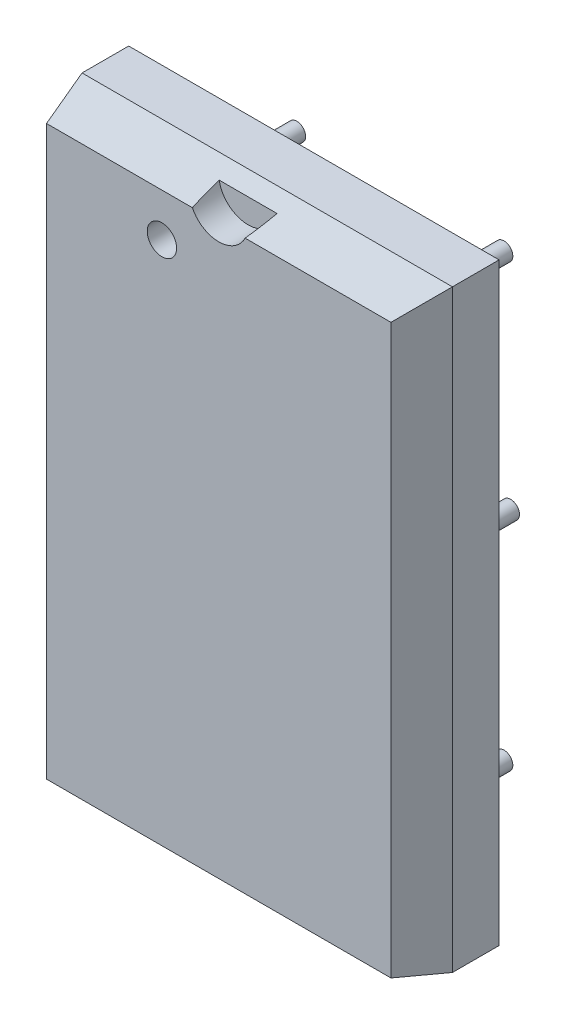
ISO-10303-21;
HEADER;
FILE_DESCRIPTION(('STEP AP214'),'2;1');
FILE_NAME('part.step','',(''),(''),'','','');
FILE_SCHEMA(('AUTOMOTIVE_DESIGN { 1 0 10303 214 1 1 1 1 }'));
ENDSEC;
DATA;
#1=APPLICATION_CONTEXT('core data for automotive mechanical design processes');
#2=APPLICATION_PROTOCOL_DEFINITION('international standard','automotive_design',2000,#1);
#3=PRODUCT_CONTEXT('',#1,'mechanical');
#4=PRODUCT('Part','Part','',(#3));
#5=PRODUCT_RELATED_PRODUCT_CATEGORY('part','',(#4));
#6=PRODUCT_DEFINITION_FORMATION('','',#4);
#7=PRODUCT_DEFINITION_CONTEXT('part definition',#1,'design');
#8=PRODUCT_DEFINITION('design','',#6,#7);
#9=PRODUCT_DEFINITION_SHAPE('','',#8);
#10=(LENGTH_UNIT() NAMED_UNIT(*) SI_UNIT(.MILLI.,.METRE.));
#11=(NAMED_UNIT(*) PLANE_ANGLE_UNIT() SI_UNIT($,.RADIAN.));
#12=(NAMED_UNIT(*) SI_UNIT($,.STERADIAN.) SOLID_ANGLE_UNIT());
#13=UNCERTAINTY_MEASURE_WITH_UNIT(LENGTH_MEASURE(1.E-05),#10,'distance_accuracy_value','');
#14=(GEOMETRIC_REPRESENTATION_CONTEXT(3) GLOBAL_UNCERTAINTY_ASSIGNED_CONTEXT((#13)) GLOBAL_UNIT_ASSIGNED_CONTEXT((#10,
#11,#12)) REPRESENTATION_CONTEXT('',''));
#15=CARTESIAN_POINT('',(0.,0.,0.));
#16=DIRECTION('',(0.,0.,1.));
#17=DIRECTION('',(1.,0.,0.));
#18=AXIS2_PLACEMENT_3D('',#15,#16,#17);
#19=CARTESIAN_POINT('',(-2.16999999999997,-17.72,0.64));
#20=DIRECTION('',(0.,0.,1.));
#21=DIRECTION('',(1.,0.,0.));
#22=AXIS2_PLACEMENT_3D('',#19,#20,#21);
#23=PLANE('',#22);
#24=CARTESIAN_POINT('',(0.606517470560689,-0.120000000000002,0.64));
#25=DIRECTION('',(0.,0.,1.));
#26=DIRECTION('',(1.,0.,0.));
#27=AXIS2_PLACEMENT_3D('',#24,#25,#26);
#28=CIRCLE('',#27,0.3);
#29=CARTESIAN_POINT('',(0.90651747056069,-0.120000000000002,0.64));
#30=VERTEX_POINT('',#29);
#31=EDGE_CURVE('E39',#30,#30,#28,.F.);
#32=ORIENTED_EDGE('',*,*,#31,.F.);
#33=EDGE_LOOP('',(#32));
#34=FACE_BOUND('',#33,.T.);
#35=CARTESIAN_POINT('',(7.65348252943937,-15.12,0.64));
#36=DIRECTION('',(0.,0.,1.));
#37=DIRECTION('',(1.,0.,0.));
#38=AXIS2_PLACEMENT_3D('',#35,#36,#37);
#39=CIRCLE('',#38,0.3);
#40=CARTESIAN_POINT('',(7.95348252943937,-15.12,0.64));
#41=VERTEX_POINT('',#40);
#42=EDGE_CURVE('E199',#41,#41,#39,.F.);
#43=ORIENTED_EDGE('',*,*,#42,.F.);
#44=EDGE_LOOP('',(#43));
#45=FACE_BOUND('',#44,.T.);
#46=CARTESIAN_POINT('',(7.88000000000003,-7.62,0.64));
#47=DIRECTION('',(0.,0.,1.));
#48=DIRECTION('',(1.,0.,0.));
#49=AXIS2_PLACEMENT_3D('',#46,#47,#48);
#50=CIRCLE('',#49,0.3);
#51=CARTESIAN_POINT('',(8.18000000000003,-7.62,0.64));
#52=VERTEX_POINT('',#51);
#53=EDGE_CURVE('E193',#52,#52,#50,.F.);
#54=ORIENTED_EDGE('',*,*,#53,.F.);
#55=EDGE_LOOP('',(#54));
#56=FACE_BOUND('',#55,.T.);
#57=DIRECTION('',(0.,1.,0.));
#58=VECTOR('',#57,1.);
#59=CARTESIAN_POINT('',(-0.519999999999953,2.48,0.64));
#60=LINE('',#59,#58);
#61=CARTESIAN_POINT('',(-0.519999999999953,-16.07,0.64));
#62=VERTEX_POINT('',#61);
#63=CARTESIAN_POINT('',(-0.519999999999953,0.829999999999977,0.64));
#64=VERTEX_POINT('',#63);
#65=EDGE_CURVE('E53',#62,#64,#60,.T.);
#66=ORIENTED_EDGE('',*,*,#65,.T.);
#67=DIRECTION('',(1.,0.,0.));
#68=VECTOR('',#67,1.);
#69=CARTESIAN_POINT('',(10.43,0.829999999999977,0.64));
#70=LINE('',#69,#68);
#71=CARTESIAN_POINT('',(8.78000000000001,0.829999999999977,0.64));
#72=VERTEX_POINT('',#71);
#73=EDGE_CURVE('E171',#64,#72,#70,.T.);
#74=ORIENTED_EDGE('',*,*,#73,.T.);
#75=DIRECTION('',(0.,-1.,0.));
#76=VECTOR('',#75,1.);
#77=CARTESIAN_POINT('',(8.78000000000001,-17.72,0.64));
#78=LINE('',#77,#76);
#79=CARTESIAN_POINT('',(8.78000000000001,-16.07,0.64));
#80=VERTEX_POINT('',#79);
#81=EDGE_CURVE('E166',#72,#80,#78,.T.);
#82=ORIENTED_EDGE('',*,*,#81,.T.);
#83=DIRECTION('',(-1.,0.,0.));
#84=VECTOR('',#83,1.);
#85=CARTESIAN_POINT('',(-2.16999999999997,-16.07,0.64));
#86=LINE('',#85,#84);
#87=EDGE_CURVE('E168',#80,#62,#86,.T.);
#88=ORIENTED_EDGE('',*,*,#87,.T.);
#89=EDGE_LOOP('',(#66,#74,#82,#88));
#90=FACE_BOUND('',#89,.T.);
#91=CARTESIAN_POINT('',(7.65348252943937,-0.120000000000002,0.64));
#92=DIRECTION('',(0.,0.,1.));
#93=DIRECTION('',(1.,0.,0.));
#94=AXIS2_PLACEMENT_3D('',#91,#92,#93);
#95=CIRCLE('',#94,0.3);
#96=CARTESIAN_POINT('',(7.95348252943937,-0.120000000000002,0.64));
#97=VERTEX_POINT('',#96);
#98=EDGE_CURVE('E196',#97,#97,#95,.F.);
#99=ORIENTED_EDGE('',*,*,#98,.F.);
#100=EDGE_LOOP('',(#99));
#101=FACE_BOUND('',#100,.T.);
#102=CARTESIAN_POINT('',(0.606517470560686,-15.12,0.64));
#103=DIRECTION('',(0.,0.,1.));
#104=DIRECTION('',(1.,0.,0.));
#105=AXIS2_PLACEMENT_3D('',#102,#103,#104);
#106=CIRCLE('',#105,0.3);
#107=CARTESIAN_POINT('',(0.906517470560686,-15.12,0.64));
#108=VERTEX_POINT('',#107);
#109=EDGE_CURVE('E202',#108,#108,#106,.F.);
#110=ORIENTED_EDGE('',*,*,#109,.F.);
#111=EDGE_LOOP('',(#110));
#112=FACE_BOUND('',#111,.T.);
#113=CARTESIAN_POINT('',(0.380000000000027,-7.62,0.64));
#114=DIRECTION('',(0.,0.,1.));
#115=DIRECTION('',(1.,0.,0.));
#116=AXIS2_PLACEMENT_3D('',#113,#114,#115);
#117=CIRCLE('',#116,0.3);
#118=CARTESIAN_POINT('',(0.680000000000027,-7.62,0.64));
#119=VERTEX_POINT('',#118);
#120=EDGE_CURVE('E11',#119,#119,#117,.F.);
#121=ORIENTED_EDGE('',*,*,#120,.F.);
#122=EDGE_LOOP('',(#121));
#123=FACE_BOUND('',#122,.T.);
#124=ADVANCED_FACE('F31',(#34,#45,#56,#90,#101,#112,#123),#23,.F.);
#125=CARTESIAN_POINT('',(-2.16999999999997,2.48,0.64));
#126=DIRECTION('',(-1.,0.,0.));
#127=DIRECTION('',(0.,0.,1.));
#128=AXIS2_PLACEMENT_3D('',#125,#126,#127);
#129=PLANE('',#128);
#130=DIRECTION('',(0.,0.,1.));
#131=VECTOR('',#130,1.);
#132=CARTESIAN_POINT('',(-2.16999999999997,-17.72,0.64));
#133=LINE('',#132,#131);
#134=CARTESIAN_POINT('',(-2.16999999999997,-17.72,1.08211616751135));
#135=VERTEX_POINT('',#134);
#136=CARTESIAN_POINT('',(-2.16999999999997,-17.72,2.66999999999998));
#137=VERTEX_POINT('',#136);
#138=EDGE_CURVE('E141',#135,#137,#133,.T.);
#139=ORIENTED_EDGE('',*,*,#138,.T.);
#140=DIRECTION('',(0.,1.,0.));
#141=VECTOR('',#140,1.);
#142=CARTESIAN_POINT('',(-2.16999999999997,2.48,2.66999999999998));
#143=LINE('',#142,#141);
#144=CARTESIAN_POINT('',(-2.16999999999997,2.48,2.66999999999998));
#145=VERTEX_POINT('',#144);
#146=EDGE_CURVE('E150',#137,#145,#143,.T.);
#147=ORIENTED_EDGE('',*,*,#146,.T.);
#148=DIRECTION('',(0.,0.,1.));
#149=VECTOR('',#148,1.);
#150=CARTESIAN_POINT('',(-2.16999999999997,2.48,0.64));
#151=LINE('',#150,#149);
#152=CARTESIAN_POINT('',(-2.16999999999997,2.48,1.08211616751135));
#153=VERTEX_POINT('',#152);
#154=EDGE_CURVE('E133',#153,#145,#151,.T.);
#155=ORIENTED_EDGE('',*,*,#154,.F.);
#156=DIRECTION('',(0.,-1.,0.));
#157=VECTOR('',#156,1.);
#158=CARTESIAN_POINT('',(-2.16999999999997,-17.72,1.08211616751135));
#159=LINE('',#158,#157);
#160=EDGE_CURVE('E148',#153,#135,#159,.T.);
#161=ORIENTED_EDGE('',*,*,#160,.T.);
#162=EDGE_LOOP('',(#139,#147,#155,#161));
#163=FACE_BOUND('',#162,.T.);
#164=ADVANCED_FACE('F211',(#163),#129,.T.);
#165=CARTESIAN_POINT('',(-2.16999999999997,2.48,0.64));
#166=DIRECTION('',(0.,1.,0.));
#167=DIRECTION('',(-1.,0.,0.));
#168=AXIS2_PLACEMENT_3D('',#165,#166,#167);
#169=PLANE('',#168);
#170=ORIENTED_EDGE('',*,*,#154,.T.);
#171=DIRECTION('',(1.,0.,0.));
#172=VECTOR('',#171,1.);
#173=CARTESIAN_POINT('',(-2.16999999999997,2.48,2.66999999999998));
#174=LINE('',#173,#172);
#175=CARTESIAN_POINT('',(10.43,2.48,2.66999999999998));
#176=VERTEX_POINT('',#175);
#177=EDGE_CURVE('E164',#145,#176,#174,.T.);
#178=ORIENTED_EDGE('',*,*,#177,.T.);
#179=DIRECTION('',(0.,0.,1.));
#180=VECTOR('',#179,1.);
#181=CARTESIAN_POINT('',(10.43,2.48,0.64));
#182=LINE('',#181,#180);
#183=CARTESIAN_POINT('',(10.43,2.48,1.08211616751135));
#184=VERTEX_POINT('',#183);
#185=EDGE_CURVE('E137',#184,#176,#182,.T.);
#186=ORIENTED_EDGE('',*,*,#185,.F.);
#187=DIRECTION('',(-1.,0.,0.));
#188=VECTOR('',#187,1.);
#189=CARTESIAN_POINT('',(-2.16999999999997,2.48,1.08211616751135));
#190=LINE('',#189,#188);
#191=EDGE_CURVE('E161',#184,#153,#190,.T.);
#192=ORIENTED_EDGE('',*,*,#191,.T.);
#193=EDGE_LOOP('',(#170,#178,#186,#192));
#194=FACE_BOUND('',#193,.T.);
#195=ADVANCED_FACE('F293',(#194),#169,.T.);
#196=CARTESIAN_POINT('',(10.43,2.48,0.64));
#197=DIRECTION('',(1.,0.,0.));
#198=DIRECTION('',(0.,1.,0.));
#199=AXIS2_PLACEMENT_3D('',#196,#197,#198);
#200=PLANE('',#199);
#201=ORIENTED_EDGE('',*,*,#185,.T.);
#202=DIRECTION('',(0.,-1.,0.));
#203=VECTOR('',#202,1.);
#204=CARTESIAN_POINT('',(10.43,2.48,2.66999999999998));
#205=LINE('',#204,#203);
#206=CARTESIAN_POINT('',(10.43,-17.72,2.66999999999998));
#207=VERTEX_POINT('',#206);
#208=EDGE_CURVE('E159',#176,#207,#205,.T.);
#209=ORIENTED_EDGE('',*,*,#208,.T.);
#210=DIRECTION('',(0.,0.,1.));
#211=VECTOR('',#210,1.);
#212=CARTESIAN_POINT('',(10.43,-17.72,0.64));
#213=LINE('',#212,#211);
#214=CARTESIAN_POINT('',(10.43,-17.72,1.08211616751135));
#215=VERTEX_POINT('',#214);
#216=EDGE_CURVE('E358',#215,#207,#213,.T.);
#217=ORIENTED_EDGE('',*,*,#216,.F.);
#218=DIRECTION('',(0.,1.,0.));
#219=VECTOR('',#218,1.);
#220=CARTESIAN_POINT('',(10.43,2.48,1.08211616751135));
#221=LINE('',#220,#219);
#222=EDGE_CURVE('E157',#215,#184,#221,.T.);
#223=ORIENTED_EDGE('',*,*,#222,.T.);
#224=EDGE_LOOP('',(#201,#209,#217,#223));
#225=FACE_BOUND('',#224,.T.);
#226=ADVANCED_FACE('F296',(#225),#200,.T.);
#227=CARTESIAN_POINT('',(-2.16999999999997,-17.72,0.64));
#228=DIRECTION('',(0.,-1.,0.));
#229=DIRECTION('',(0.,0.,-1.));
#230=AXIS2_PLACEMENT_3D('',#227,#228,#229);
#231=PLANE('',#230);
#232=ORIENTED_EDGE('',*,*,#216,.T.);
#233=DIRECTION('',(-1.,0.,0.));
#234=VECTOR('',#233,1.);
#235=CARTESIAN_POINT('',(-2.16999999999997,-17.72,2.66999999999998));
#236=LINE('',#235,#234);
#237=EDGE_CURVE('E155',#207,#137,#236,.T.);
#238=ORIENTED_EDGE('',*,*,#237,.T.);
#239=ORIENTED_EDGE('',*,*,#138,.F.);
#240=DIRECTION('',(1.,0.,0.));
#241=VECTOR('',#240,1.);
#242=CARTESIAN_POINT('',(10.43,-17.72,1.08211616751135));
#243=LINE('',#242,#241);
#244=EDGE_CURVE('E153',#135,#215,#243,.T.);
#245=ORIENTED_EDGE('',*,*,#244,.T.);
#246=EDGE_LOOP('',(#232,#238,#239,#245));
#247=FACE_BOUND('',#246,.T.);
#248=ADVANCED_FACE('F291',(#247),#231,.T.);
#249=CARTESIAN_POINT('',(-2.16999999999997,-17.72,4.32));
#250=DIRECTION('',(0.,0.,1.));
#251=DIRECTION('',(1.,0.,0.));
#252=AXIS2_PLACEMENT_3D('',#249,#250,#251);
#253=PLANE('',#252);
#254=CARTESIAN_POINT('',(2.19743495912768,0.574075773299122,4.32));
#255=DIRECTION('',(0.,0.,1.));
#256=DIRECTION('',(1.,0.,0.));
#257=AXIS2_PLACEMENT_3D('',#254,#255,#256);
#258=CIRCLE('',#257,0.5);
#259=CARTESIAN_POINT('',(2.69743495912768,0.574075773299122,4.32));
#260=VERTEX_POINT('',#259);
#261=EDGE_CURVE('E362',#260,#260,#258,.T.);
#262=ORIENTED_EDGE('',*,*,#261,.F.);
#263=EDGE_LOOP('',(#262));
#264=FACE_BOUND('',#263,.T.);
#265=CARTESIAN_POINT('',(4.13000000000003,2.48,4.32));
#266=DIRECTION('',(0.,0.,1.));
#267=DIRECTION('',(1.,0.,0.));
#268=AXIS2_PLACEMENT_3D('',#265,#266,#267);
#269=CIRCLE('',#268,1.);
#270=CARTESIAN_POINT('',(3.23304220030983,2.03788383248865,4.32));
#271=VERTEX_POINT('',#270);
#272=CARTESIAN_POINT('',(5.02695779969022,2.03788383248865,4.32));
#273=VERTEX_POINT('',#272);
#274=EDGE_CURVE('E111',#271,#273,#269,.T.);
#275=ORIENTED_EDGE('',*,*,#274,.F.);
#276=DIRECTION('',(-1.,0.,0.));
#277=VECTOR('',#276,1.);
#278=CARTESIAN_POINT('',(-2.16999999999998,2.03788383248864,4.32));
#279=LINE('',#278,#277);
#280=CARTESIAN_POINT('',(-1.72788383248862,2.03788383248864,4.32));
#281=VERTEX_POINT('',#280);
#282=EDGE_CURVE('E123',#271,#281,#279,.T.);
#283=ORIENTED_EDGE('',*,*,#282,.T.);
#284=DIRECTION('',(0.,-1.,0.));
#285=VECTOR('',#284,1.);
#286=CARTESIAN_POINT('',(-1.72788383248862,-17.72,4.32));
#287=LINE('',#286,#285);
#288=CARTESIAN_POINT('',(-1.72788383248862,-17.2778838324886,4.32));
#289=VERTEX_POINT('',#288);
#290=EDGE_CURVE('E146',#281,#289,#287,.T.);
#291=ORIENTED_EDGE('',*,*,#290,.T.);
#292=DIRECTION('',(1.,0.,0.));
#293=VECTOR('',#292,1.);
#294=CARTESIAN_POINT('',(-2.16999999999997,-17.2778838324886,4.32));
#295=LINE('',#294,#293);
#296=CARTESIAN_POINT('',(9.98788383248868,-17.2778838324886,4.32));
#297=VERTEX_POINT('',#296);
#298=EDGE_CURVE('E144',#289,#297,#295,.T.);
#299=ORIENTED_EDGE('',*,*,#298,.T.);
#300=DIRECTION('',(0.,1.,0.));
#301=VECTOR('',#300,1.);
#302=CARTESIAN_POINT('',(9.98788383248868,-17.72,4.32));
#303=LINE('',#302,#301);
#304=CARTESIAN_POINT('',(9.98788383248868,2.03788383248865,4.32));
#305=VERTEX_POINT('',#304);
#306=EDGE_CURVE('E135',#297,#305,#303,.T.);
#307=ORIENTED_EDGE('',*,*,#306,.T.);
#308=EDGE_CURVE('E126',#305,#273,#279,.T.);
#309=ORIENTED_EDGE('',*,*,#308,.T.);
#310=EDGE_LOOP('',(#275,#283,#291,#299,#307,#309));
#311=FACE_BOUND('',#310,.T.);
#312=ADVANCED_FACE('F121',(#264,#311),#253,.T.);
#313=CARTESIAN_POINT('',(9.98788383248868,-17.72,4.32));
#314=DIRECTION('',(-0.965925826289069,0.,-0.258819045102517));
#315=DIRECTION('',(-0.258819045102517,0.,0.965925826289069));
#316=AXIS2_PLACEMENT_3D('',#313,#314,#315);
#317=PLANE('',#316);
#318=DIRECTION('',(0.250562807085728,-0.250562807085728,-0.935113126531031));
#319=VECTOR('',#318,1.);
#320=CARTESIAN_POINT('',(10.0156406460551,-17.3056406460551,4.21641016151378));
#321=LINE('',#320,#319);
#322=EDGE_CURVE('E177',#207,#297,#321,.F.);
#323=ORIENTED_EDGE('',*,*,#322,.F.);
#324=ORIENTED_EDGE('',*,*,#208,.F.);
#325=DIRECTION('',(0.250562807085728,0.25056280708573,-0.935113126531031));
#326=VECTOR('',#325,1.);
#327=CARTESIAN_POINT('',(9.22459097034216,1.27459097034213,7.16864774258549));
#328=LINE('',#327,#326);
#329=EDGE_CURVE('E180',#305,#176,#328,.T.);
#330=ORIENTED_EDGE('',*,*,#329,.F.);
#331=ORIENTED_EDGE('',*,*,#306,.F.);
#332=EDGE_LOOP('',(#323,#324,#330,#331));
#333=FACE_BOUND('',#332,.T.);
#334=ADVANCED_FACE('F290',(#333),#317,.F.);
#335=CARTESIAN_POINT('',(-2.16999999999998,2.03788383248864,4.32));
#336=DIRECTION('',(0.,-0.965925826289069,-0.258819045102519));
#337=DIRECTION('',(0.,0.258819045102519,-0.965925826289069));
#338=AXIS2_PLACEMENT_3D('',#335,#336,#337);
#339=PLANE('',#338);
#340=CARTESIAN_POINT('',(4.13000000000003,2.48,2.66999999999998));
#341=DIRECTION('',(0.,-0.965925826289069,-0.258819045102519));
#342=DIRECTION('',(0.,-0.258819045102519,0.965925826289069));
#343=AXIS2_PLACEMENT_3D('',#340,#341,#342);
#344=ELLIPSE('',#343,3.8637033051563,1.);
#345=CARTESIAN_POINT('',(5.11471613411757,2.30583302491977,3.32));
#346=VERTEX_POINT('',#345);
#347=EDGE_CURVE('E116',#273,#346,#344,.F.);
#348=ORIENTED_EDGE('',*,*,#347,.F.);
#349=ORIENTED_EDGE('',*,*,#308,.F.);
#350=ORIENTED_EDGE('',*,*,#329,.T.);
#351=ORIENTED_EDGE('',*,*,#177,.F.);
#352=DIRECTION('',(0.250562807085729,-0.25056280708573,0.93511312653103));
#353=VECTOR('',#352,1.);
#354=CARTESIAN_POINT('',(-1.75564064605507,2.0656406460551,4.21641016151378));
#355=LINE('',#354,#353);
#356=EDGE_CURVE('E131',#281,#145,#355,.F.);
#357=ORIENTED_EDGE('',*,*,#356,.F.);
#358=ORIENTED_EDGE('',*,*,#282,.F.);
#359=CARTESIAN_POINT('',(3.14528386588248,2.30583302491977,3.32));
#360=VERTEX_POINT('',#359);
#361=EDGE_CURVE('E108',#360,#271,#344,.F.);
#362=ORIENTED_EDGE('',*,*,#361,.F.);
#363=DIRECTION('',(-1.,0.,0.));
#364=VECTOR('',#363,1.);
#365=CARTESIAN_POINT('',(-2.16999999999998,2.30583302491977,3.32));
#366=LINE('',#365,#364);
#367=EDGE_CURVE('E117',#360,#346,#366,.F.);
#368=ORIENTED_EDGE('',*,*,#367,.T.);
#369=EDGE_LOOP('',(#348,#349,#350,#351,#357,#358,#362,#368));
#370=FACE_BOUND('',#369,.T.);
#371=ADVANCED_FACE('F129',(#370),#339,.F.);
#372=CARTESIAN_POINT('',(-2.16999999999997,-17.2778838324886,4.32));
#373=DIRECTION('',(0.,0.965925826289069,-0.258819045102517));
#374=DIRECTION('',(0.,0.258819045102517,0.965925826289069));
#375=AXIS2_PLACEMENT_3D('',#372,#373,#374);
#376=PLANE('',#375);
#377=ORIENTED_EDGE('',*,*,#322,.T.);
#378=ORIENTED_EDGE('',*,*,#298,.F.);
#379=DIRECTION('',(-0.250562807085729,-0.250562807085728,-0.935113126531031));
#380=VECTOR('',#379,1.);
#381=CARTESIAN_POINT('',(-1.75564064605507,-17.3056406460551,4.21641016151378));
#382=LINE('',#381,#380);
#383=EDGE_CURVE('E173',#137,#289,#382,.F.);
#384=ORIENTED_EDGE('',*,*,#383,.F.);
#385=ORIENTED_EDGE('',*,*,#237,.F.);
#386=EDGE_LOOP('',(#377,#378,#384,#385));
#387=FACE_BOUND('',#386,.T.);
#388=ADVANCED_FACE('F310',(#387),#376,.F.);
#389=CARTESIAN_POINT('',(-1.72788383248862,-17.72,4.32));
#390=DIRECTION('',(0.965925826289069,0.,-0.258819045102518));
#391=DIRECTION('',(-0.258819045102518,0.,-0.965925826289069));
#392=AXIS2_PLACEMENT_3D('',#389,#390,#391);
#393=PLANE('',#392);
#394=ORIENTED_EDGE('',*,*,#356,.T.);
#395=ORIENTED_EDGE('',*,*,#146,.F.);
#396=ORIENTED_EDGE('',*,*,#383,.T.);
#397=ORIENTED_EDGE('',*,*,#290,.F.);
#398=EDGE_LOOP('',(#394,#395,#396,#397));
#399=FACE_BOUND('',#398,.T.);
#400=ADVANCED_FACE('F307',(#399),#393,.F.);
#401=CARTESIAN_POINT('',(-2.16999999999997,-17.72,1.08211616751135));
#402=DIRECTION('',(0.,-0.258819045102518,-0.965925826289069));
#403=DIRECTION('',(0.,0.965925826289069,-0.258819045102519));
#404=AXIS2_PLACEMENT_3D('',#401,#402,#403);
#405=PLANE('',#404);
#406=DIRECTION('',(0.694746590606866,0.694746590606866,-0.186156787897384));
#407=VECTOR('',#406,1.);
#408=CARTESIAN_POINT('',(-2.16999999999997,-17.72,1.08211616751135));
#409=LINE('',#408,#407);
#410=EDGE_CURVE('E187',#62,#135,#409,.F.);
#411=ORIENTED_EDGE('',*,*,#410,.F.);
#412=ORIENTED_EDGE('',*,*,#87,.F.);
#413=DIRECTION('',(-0.694746590606866,0.694746590606866,-0.186156787897384));
#414=VECTOR('',#413,1.);
#415=CARTESIAN_POINT('',(0.680008931770769,-7.97000893177074,-1.53038606543131));
#416=LINE('',#415,#414);
#417=EDGE_CURVE('E175',#215,#80,#416,.T.);
#418=ORIENTED_EDGE('',*,*,#417,.F.);
#419=ORIENTED_EDGE('',*,*,#244,.F.);
#420=EDGE_LOOP('',(#411,#412,#418,#419));
#421=FACE_BOUND('',#420,.T.);
#422=ADVANCED_FACE('F33',(#421),#405,.T.);
#423=CARTESIAN_POINT('',(10.43,2.48,1.08211616751135));
#424=DIRECTION('',(0.258819045102518,0.,-0.965925826289069));
#425=DIRECTION('',(-0.965925826289069,0.,-0.258819045102519));
#426=AXIS2_PLACEMENT_3D('',#423,#424,#425);
#427=PLANE('',#426);
#428=ORIENTED_EDGE('',*,*,#417,.T.);
#429=ORIENTED_EDGE('',*,*,#81,.F.);
#430=DIRECTION('',(0.694746590606865,0.694746590606867,0.186156787897384));
#431=VECTOR('',#430,1.);
#432=CARTESIAN_POINT('',(10.43,2.48,1.08211616751135));
#433=LINE('',#432,#431);
#434=EDGE_CURVE('E185',#184,#72,#433,.F.);
#435=ORIENTED_EDGE('',*,*,#434,.F.);
#436=ORIENTED_EDGE('',*,*,#222,.F.);
#437=EDGE_LOOP('',(#428,#429,#435,#436));
#438=FACE_BOUND('',#437,.T.);
#439=ADVANCED_FACE('F325',(#438),#427,.T.);
#440=CARTESIAN_POINT('',(-2.16999999999997,2.48,1.08211616751135));
#441=DIRECTION('',(-0.258819045102518,0.,-0.965925826289069));
#442=DIRECTION('',(-0.965925826289069,0.,0.258819045102518));
#443=AXIS2_PLACEMENT_3D('',#440,#441,#442);
#444=PLANE('',#443);
#445=ORIENTED_EDGE('',*,*,#410,.T.);
#446=ORIENTED_EDGE('',*,*,#160,.F.);
#447=DIRECTION('',(0.694746590606866,-0.694746590606866,-0.186156787897384));
#448=VECTOR('',#447,1.);
#449=CARTESIAN_POINT('',(-2.16999999999997,2.48,1.08211616751135));
#450=LINE('',#449,#448);
#451=EDGE_CURVE('E183',#64,#153,#450,.F.);
#452=ORIENTED_EDGE('',*,*,#451,.F.);
#453=ORIENTED_EDGE('',*,*,#65,.F.);
#454=EDGE_LOOP('',(#445,#446,#452,#453));
#455=FACE_BOUND('',#454,.T.);
#456=ADVANCED_FACE('F322',(#455),#444,.T.);
#457=CARTESIAN_POINT('',(-2.16999999999997,2.48,1.08211616751135));
#458=DIRECTION('',(0.,0.258819045102518,-0.965925826289069));
#459=DIRECTION('',(0.,0.965925826289069,0.258819045102518));
#460=AXIS2_PLACEMENT_3D('',#457,#458,#459);
#461=PLANE('',#460);
#462=ORIENTED_EDGE('',*,*,#434,.T.);
#463=ORIENTED_EDGE('',*,*,#73,.F.);
#464=ORIENTED_EDGE('',*,*,#451,.T.);
#465=ORIENTED_EDGE('',*,*,#191,.F.);
#466=EDGE_LOOP('',(#462,#463,#464,#465));
#467=FACE_BOUND('',#466,.T.);
#468=ADVANCED_FACE('F286',(#467),#461,.T.);
#469=CARTESIAN_POINT('',(4.13000000000003,2.48,3.32));
#470=DIRECTION('',(0.,0.,1.));
#471=DIRECTION('',(1.,0.,0.));
#472=AXIS2_PLACEMENT_3D('',#469,#470,#471);
#473=CYLINDRICAL_SURFACE('',#472,1.);
#474=ORIENTED_EDGE('',*,*,#347,.T.);
#475=CARTESIAN_POINT('',(4.13000000000003,2.48,3.32));
#476=DIRECTION('',(0.,0.,1.));
#477=DIRECTION('',(1.,0.,0.));
#478=AXIS2_PLACEMENT_3D('',#475,#476,#477);
#479=CIRCLE('',#478,1.);
#480=EDGE_CURVE('E45',#360,#346,#479,.T.);
#481=ORIENTED_EDGE('',*,*,#480,.F.);
#482=ORIENTED_EDGE('',*,*,#361,.T.);
#483=ORIENTED_EDGE('',*,*,#274,.T.);
#484=EDGE_LOOP('',(#474,#481,#482,#483));
#485=FACE_BOUND('',#484,.T.);
#486=ADVANCED_FACE('F110',(#485),#473,.F.);
#487=CARTESIAN_POINT('',(4.13000000000003,2.48,3.32));
#488=DIRECTION('',(0.,0.,1.));
#489=DIRECTION('',(1.,0.,0.));
#490=AXIS2_PLACEMENT_3D('',#487,#488,#489);
#491=PLANE('',#490);
#492=ORIENTED_EDGE('',*,*,#480,.T.);
#493=ORIENTED_EDGE('',*,*,#367,.F.);
#494=EDGE_LOOP('',(#492,#493));
#495=FACE_BOUND('',#494,.T.);
#496=ADVANCED_FACE('F281',(#495),#491,.T.);
#497=CARTESIAN_POINT('',(2.19743495912768,0.574075773299122,3.32));
#498=DIRECTION('',(0.,0.,1.));
#499=DIRECTION('',(1.,0.,0.));
#500=AXIS2_PLACEMENT_3D('',#497,#498,#499);
#501=CYLINDRICAL_SURFACE('',#500,0.5);
#502=CARTESIAN_POINT('',(2.19743495912768,0.574075773299122,3.32));
#503=DIRECTION('',(0.,0.,1.));
#504=DIRECTION('',(1.,0.,0.));
#505=AXIS2_PLACEMENT_3D('',#502,#503,#504);
#506=CIRCLE('',#505,0.5);
#507=CARTESIAN_POINT('',(2.69743495912768,0.574075773299122,3.32));
#508=VERTEX_POINT('',#507);
#509=EDGE_CURVE('E127',#508,#508,#506,.T.);
#510=ORIENTED_EDGE('',*,*,#509,.F.);
#511=EDGE_LOOP('',(#510));
#512=FACE_BOUND('',#511,.T.);
#513=ORIENTED_EDGE('',*,*,#261,.T.);
#514=EDGE_LOOP('',(#513));
#515=FACE_BOUND('',#514,.T.);
#516=ADVANCED_FACE('F277',(#512,#515),#501,.F.);
#517=CARTESIAN_POINT('',(2.19743495912768,0.574075773299122,3.32));
#518=DIRECTION('',(0.,0.,1.));
#519=DIRECTION('',(1.,0.,0.));
#520=AXIS2_PLACEMENT_3D('',#517,#518,#519);
#521=PLANE('',#520);
#522=ORIENTED_EDGE('',*,*,#509,.T.);
#523=EDGE_LOOP('',(#522));
#524=FACE_BOUND('',#523,.T.);
#525=ADVANCED_FACE('F273',(#524),#521,.T.);
#526=CARTESIAN_POINT('',(7.88000000000003,-7.62,-1.86));
#527=DIRECTION('',(0.,0.,1.));
#528=DIRECTION('',(1.,0.,0.));
#529=AXIS2_PLACEMENT_3D('',#526,#527,#528);
#530=CYLINDRICAL_SURFACE('',#529,0.3);
#531=CARTESIAN_POINT('',(7.88000000000003,-7.62,-1.86));
#532=DIRECTION('',(0.,0.,-1.));
#533=DIRECTION('',(-1.,0.,0.));
#534=AXIS2_PLACEMENT_3D('',#531,#532,#533);
#535=CIRCLE('',#534,0.3);
#536=CARTESIAN_POINT('',(7.58000000000003,-7.62,-1.86));
#537=VERTEX_POINT('',#536);
#538=EDGE_CURVE('E365',#537,#537,#535,.T.);
#539=ORIENTED_EDGE('',*,*,#538,.F.);
#540=EDGE_LOOP('',(#539));
#541=FACE_BOUND('',#540,.T.);
#542=ORIENTED_EDGE('',*,*,#53,.T.);
#543=EDGE_LOOP('',(#542));
#544=FACE_BOUND('',#543,.T.);
#545=ADVANCED_FACE('F269',(#541,#544),#530,.T.);
#546=CARTESIAN_POINT('',(7.88000000000003,-7.62,-1.86));
#547=DIRECTION('',(0.,0.,-1.));
#548=DIRECTION('',(-1.,0.,0.));
#549=AXIS2_PLACEMENT_3D('',#546,#547,#548);
#550=PLANE('',#549);
#551=ORIENTED_EDGE('',*,*,#538,.T.);
#552=EDGE_LOOP('',(#551));
#553=FACE_BOUND('',#552,.T.);
#554=ADVANCED_FACE('F265',(#553),#550,.T.);
#555=CARTESIAN_POINT('',(7.65348252943937,-0.120000000000002,-1.86));
#556=DIRECTION('',(0.,0.,1.));
#557=DIRECTION('',(1.,0.,0.));
#558=AXIS2_PLACEMENT_3D('',#555,#556,#557);
#559=CYLINDRICAL_SURFACE('',#558,0.3);
#560=CARTESIAN_POINT('',(7.65348252943937,-0.120000000000002,-1.86));
#561=DIRECTION('',(0.,0.,-1.));
#562=DIRECTION('',(-1.,0.,0.));
#563=AXIS2_PLACEMENT_3D('',#560,#561,#562);
#564=CIRCLE('',#563,0.3);
#565=CARTESIAN_POINT('',(7.35348252943937,-0.120000000000002,-1.86));
#566=VERTEX_POINT('',#565);
#567=EDGE_CURVE('E370',#566,#566,#564,.T.);
#568=ORIENTED_EDGE('',*,*,#567,.F.);
#569=EDGE_LOOP('',(#568));
#570=FACE_BOUND('',#569,.T.);
#571=ORIENTED_EDGE('',*,*,#98,.T.);
#572=EDGE_LOOP('',(#571));
#573=FACE_BOUND('',#572,.T.);
#574=ADVANCED_FACE('F261',(#570,#573),#559,.T.);
#575=CARTESIAN_POINT('',(7.65348252943937,-0.120000000000002,-1.86));
#576=DIRECTION('',(0.,0.,-1.));
#577=DIRECTION('',(-1.,0.,0.));
#578=AXIS2_PLACEMENT_3D('',#575,#576,#577);
#579=PLANE('',#578);
#580=ORIENTED_EDGE('',*,*,#567,.T.);
#581=EDGE_LOOP('',(#580));
#582=FACE_BOUND('',#581,.T.);
#583=ADVANCED_FACE('F257',(#582),#579,.T.);
#584=CARTESIAN_POINT('',(7.65348252943937,-15.12,-1.86));
#585=DIRECTION('',(0.,0.,1.));
#586=DIRECTION('',(1.,0.,0.));
#587=AXIS2_PLACEMENT_3D('',#584,#585,#586);
#588=CYLINDRICAL_SURFACE('',#587,0.3);
#589=CARTESIAN_POINT('',(7.65348252943937,-15.12,-1.86));
#590=DIRECTION('',(0.,0.,-1.));
#591=DIRECTION('',(-1.,0.,0.));
#592=AXIS2_PLACEMENT_3D('',#589,#590,#591);
#593=CIRCLE('',#592,0.3);
#594=CARTESIAN_POINT('',(7.35348252943937,-15.12,-1.86));
#595=VERTEX_POINT('',#594);
#596=EDGE_CURVE('E373',#595,#595,#593,.T.);
#597=ORIENTED_EDGE('',*,*,#596,.F.);
#598=EDGE_LOOP('',(#597));
#599=FACE_BOUND('',#598,.T.);
#600=ORIENTED_EDGE('',*,*,#42,.T.);
#601=EDGE_LOOP('',(#600));
#602=FACE_BOUND('',#601,.T.);
#603=ADVANCED_FACE('F253',(#599,#602),#588,.T.);
#604=CARTESIAN_POINT('',(7.65348252943937,-15.12,-1.86));
#605=DIRECTION('',(0.,0.,-1.));
#606=DIRECTION('',(-1.,0.,0.));
#607=AXIS2_PLACEMENT_3D('',#604,#605,#606);
#608=PLANE('',#607);
#609=ORIENTED_EDGE('',*,*,#596,.T.);
#610=EDGE_LOOP('',(#609));
#611=FACE_BOUND('',#610,.T.);
#612=ADVANCED_FACE('F249',(#611),#608,.T.);
#613=CARTESIAN_POINT('',(0.606517470560686,-15.12,-1.86));
#614=DIRECTION('',(0.,0.,1.));
#615=DIRECTION('',(1.,0.,0.));
#616=AXIS2_PLACEMENT_3D('',#613,#614,#615);
#617=CYLINDRICAL_SURFACE('',#616,0.3);
#618=CARTESIAN_POINT('',(0.606517470560686,-15.12,-1.86));
#619=DIRECTION('',(0.,0.,-1.));
#620=DIRECTION('',(1.,0.,0.));
#621=AXIS2_PLACEMENT_3D('',#618,#619,#620);
#622=CIRCLE('',#621,0.3);
#623=CARTESIAN_POINT('',(0.906517470560686,-15.12,-1.86));
#624=VERTEX_POINT('',#623);
#625=EDGE_CURVE('E376',#624,#624,#622,.T.);
#626=ORIENTED_EDGE('',*,*,#625,.F.);
#627=EDGE_LOOP('',(#626));
#628=FACE_BOUND('',#627,.T.);
#629=ORIENTED_EDGE('',*,*,#109,.T.);
#630=EDGE_LOOP('',(#629));
#631=FACE_BOUND('',#630,.T.);
#632=ADVANCED_FACE('F245',(#628,#631),#617,.T.);
#633=CARTESIAN_POINT('',(0.606517470560686,-15.12,-1.86));
#634=DIRECTION('',(0.,0.,1.));
#635=DIRECTION('',(1.,0.,0.));
#636=AXIS2_PLACEMENT_3D('',#633,#634,#635);
#637=PLANE('',#636);
#638=ORIENTED_EDGE('',*,*,#625,.T.);
#639=EDGE_LOOP('',(#638));
#640=FACE_BOUND('',#639,.T.);
#641=ADVANCED_FACE('F241',(#640),#637,.F.);
#642=CARTESIAN_POINT('',(0.606517470560689,-0.120000000000002,-1.86));
#643=DIRECTION('',(0.,0.,1.));
#644=DIRECTION('',(1.,0.,0.));
#645=AXIS2_PLACEMENT_3D('',#642,#643,#644);
#646=CYLINDRICAL_SURFACE('',#645,0.3);
#647=CARTESIAN_POINT('',(0.606517470560689,-0.120000000000002,-1.86));
#648=DIRECTION('',(0.,0.,-1.));
#649=DIRECTION('',(1.,0.,0.));
#650=AXIS2_PLACEMENT_3D('',#647,#648,#649);
#651=CIRCLE('',#650,0.3);
#652=CARTESIAN_POINT('',(0.90651747056069,-0.120000000000002,-1.86));
#653=VERTEX_POINT('',#652);
#654=EDGE_CURVE('E379',#653,#653,#651,.T.);
#655=ORIENTED_EDGE('',*,*,#654,.F.);
#656=EDGE_LOOP('',(#655));
#657=FACE_BOUND('',#656,.T.);
#658=ORIENTED_EDGE('',*,*,#31,.T.);
#659=EDGE_LOOP('',(#658));
#660=FACE_BOUND('',#659,.T.);
#661=ADVANCED_FACE('F207',(#657,#660),#646,.T.);
#662=CARTESIAN_POINT('',(0.606517470560689,-0.120000000000002,-1.86));
#663=DIRECTION('',(0.,0.,1.));
#664=DIRECTION('',(1.,0.,0.));
#665=AXIS2_PLACEMENT_3D('',#662,#663,#664);
#666=PLANE('',#665);
#667=ORIENTED_EDGE('',*,*,#654,.T.);
#668=EDGE_LOOP('',(#667));
#669=FACE_BOUND('',#668,.T.);
#670=ADVANCED_FACE('F226',(#669),#666,.F.);
#671=CARTESIAN_POINT('',(0.380000000000027,-7.62,-1.86));
#672=DIRECTION('',(0.,0.,1.));
#673=DIRECTION('',(1.,0.,0.));
#674=AXIS2_PLACEMENT_3D('',#671,#672,#673);
#675=CYLINDRICAL_SURFACE('',#674,0.3);
#676=CARTESIAN_POINT('',(0.380000000000027,-7.62,-1.86));
#677=DIRECTION('',(0.,0.,-1.));
#678=DIRECTION('',(1.,0.,0.));
#679=AXIS2_PLACEMENT_3D('',#676,#677,#678);
#680=CIRCLE('',#679,0.3);
#681=CARTESIAN_POINT('',(0.680000000000027,-7.62,-1.86));
#682=VERTEX_POINT('',#681);
#683=EDGE_CURVE('E382',#682,#682,#680,.T.);
#684=ORIENTED_EDGE('',*,*,#683,.F.);
#685=EDGE_LOOP('',(#684));
#686=FACE_BOUND('',#685,.T.);
#687=ORIENTED_EDGE('',*,*,#120,.T.);
#688=EDGE_LOOP('',(#687));
#689=FACE_BOUND('',#688,.T.);
#690=ADVANCED_FACE('F223',(#686,#689),#675,.T.);
#691=CARTESIAN_POINT('',(0.380000000000027,-7.62,-1.86));
#692=DIRECTION('',(0.,0.,1.));
#693=DIRECTION('',(1.,0.,0.));
#694=AXIS2_PLACEMENT_3D('',#691,#692,#693);
#695=PLANE('',#694);
#696=ORIENTED_EDGE('',*,*,#683,.T.);
#697=EDGE_LOOP('',(#696));
#698=FACE_BOUND('',#697,.T.);
#699=ADVANCED_FACE('F225',(#698),#695,.F.);
#700=CLOSED_SHELL('',(#124,#164,#195,#226,#248,#312,#334,#371,#388,#400,#422,#439,#456,#468,
#486,#496,#516,#525,#545,#554,#574,#583,#603,#612,#632,#641,#661,#670,#690,#699));
#701=MANIFOLD_SOLID_BREP('B2',#700);
#702=ADVANCED_BREP_SHAPE_REPRESENTATION('',(#18,#701),#14);
#703=SHAPE_DEFINITION_REPRESENTATION(#9,#702);
ENDSEC;
END-ISO-10303-21;
